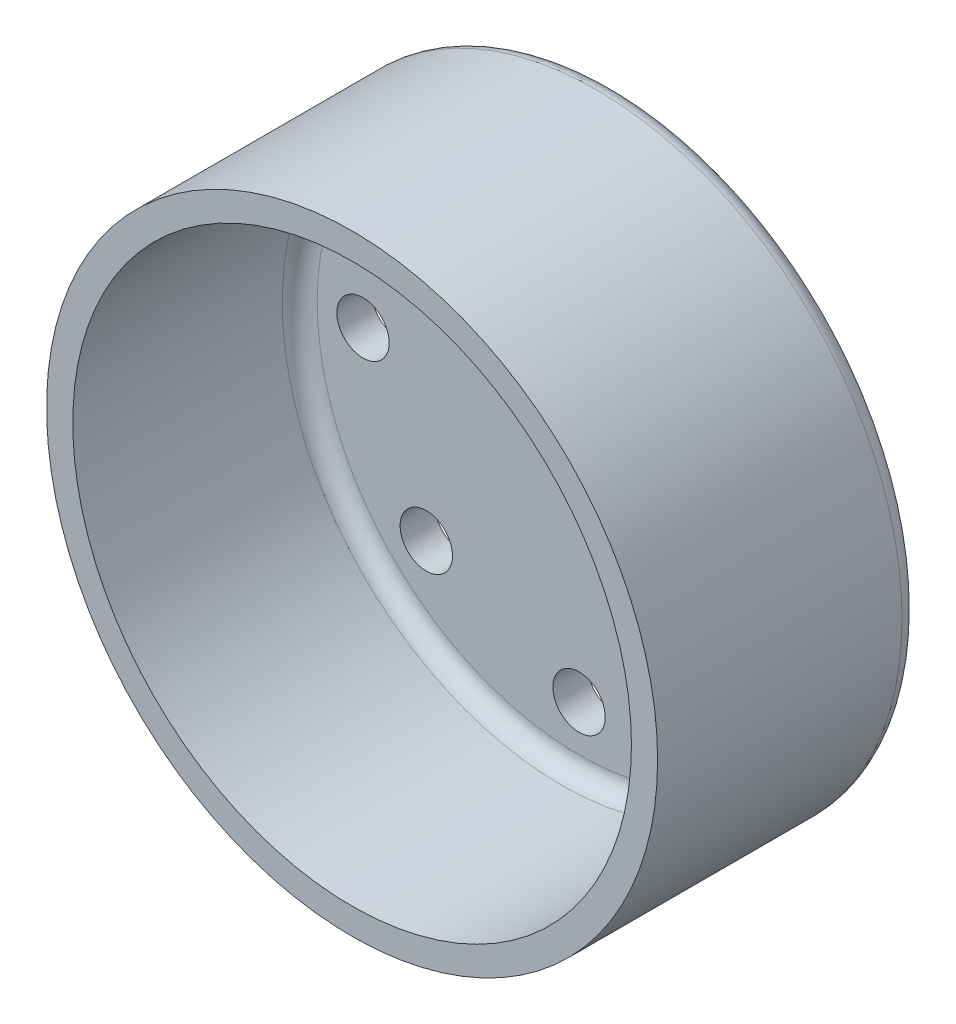
ISO-10303-21;
HEADER;
FILE_DESCRIPTION(('STEP AP214'),'2;1');
FILE_NAME('part.step','',(''),(''),'','','');
FILE_SCHEMA(('AUTOMOTIVE_DESIGN { 1 0 10303 214 1 1 1 1 }'));
ENDSEC;
DATA;
#1=APPLICATION_CONTEXT('core data for automotive mechanical design processes');
#2=APPLICATION_PROTOCOL_DEFINITION('international standard','automotive_design',2000,#1);
#3=PRODUCT_CONTEXT('',#1,'mechanical');
#4=PRODUCT('Part','Part','',(#3));
#5=PRODUCT_RELATED_PRODUCT_CATEGORY('part','',(#4));
#6=PRODUCT_DEFINITION_FORMATION('','',#4);
#7=PRODUCT_DEFINITION_CONTEXT('part definition',#1,'design');
#8=PRODUCT_DEFINITION('design','',#6,#7);
#9=PRODUCT_DEFINITION_SHAPE('','',#8);
#10=(LENGTH_UNIT() NAMED_UNIT(*) SI_UNIT(.MILLI.,.METRE.));
#11=(NAMED_UNIT(*) PLANE_ANGLE_UNIT() SI_UNIT($,.RADIAN.));
#12=(NAMED_UNIT(*) SI_UNIT($,.STERADIAN.) SOLID_ANGLE_UNIT());
#13=UNCERTAINTY_MEASURE_WITH_UNIT(LENGTH_MEASURE(1.E-05),#10,'distance_accuracy_value','');
#14=(GEOMETRIC_REPRESENTATION_CONTEXT(3) GLOBAL_UNCERTAINTY_ASSIGNED_CONTEXT((#13)) GLOBAL_UNIT_ASSIGNED_CONTEXT((#10,
#11,#12)) REPRESENTATION_CONTEXT('',''));
#15=CARTESIAN_POINT('',(0.,0.,0.));
#16=DIRECTION('',(0.,0.,1.));
#17=DIRECTION('',(1.,0.,0.));
#18=AXIS2_PLACEMENT_3D('',#15,#16,#17);
#19=CARTESIAN_POINT('',(-17.5,-17.5,60.));
#20=DIRECTION('',(0.,0.,-1.));
#21=DIRECTION('',(-1.,0.,0.));
#22=AXIS2_PLACEMENT_3D('',#19,#20,#21);
#23=CYLINDRICAL_SURFACE('',#22,3.);
#24=CARTESIAN_POINT('',(-17.5,-17.5,0.));
#25=DIRECTION('',(0.,0.,-1.));
#26=DIRECTION('',(-1.,0.,0.));
#27=AXIS2_PLACEMENT_3D('',#24,#25,#26);
#28=CIRCLE('',#27,3.);
#29=CARTESIAN_POINT('',(-20.5,-17.5,0.));
#30=VERTEX_POINT('',#29);
#31=EDGE_CURVE('E82',#30,#30,#28,.T.);
#32=ORIENTED_EDGE('',*,*,#31,.T.);
#33=EDGE_LOOP('',(#32));
#34=FACE_BOUND('',#33,.T.);
#35=CARTESIAN_POINT('',(-17.5,-17.5,4.));
#36=DIRECTION('',(0.,0.,1.));
#37=DIRECTION('',(1.,0.,0.));
#38=AXIS2_PLACEMENT_3D('',#35,#36,#37);
#39=CIRCLE('',#38,3.);
#40=CARTESIAN_POINT('',(-14.5,-17.5,4.));
#41=VERTEX_POINT('',#40);
#42=EDGE_CURVE('E95',#41,#41,#39,.F.);
#43=ORIENTED_EDGE('',*,*,#42,.F.);
#44=EDGE_LOOP('',(#43));
#45=FACE_BOUND('',#44,.T.);
#46=ADVANCED_FACE('F54',(#34,#45),#23,.F.);
#47=CARTESIAN_POINT('',(17.5,-17.5,60.));
#48=DIRECTION('',(0.,0.,-1.));
#49=DIRECTION('',(-1.,0.,0.));
#50=AXIS2_PLACEMENT_3D('',#47,#48,#49);
#51=CYLINDRICAL_SURFACE('',#50,3.);
#52=CARTESIAN_POINT('',(17.5,-17.5,0.));
#53=DIRECTION('',(0.,0.,-1.));
#54=DIRECTION('',(-1.,0.,0.));
#55=AXIS2_PLACEMENT_3D('',#52,#53,#54);
#56=CIRCLE('',#55,3.);
#57=CARTESIAN_POINT('',(14.5,-17.5,0.));
#58=VERTEX_POINT('',#57);
#59=EDGE_CURVE('E85',#58,#58,#56,.T.);
#60=ORIENTED_EDGE('',*,*,#59,.T.);
#61=EDGE_LOOP('',(#60));
#62=FACE_BOUND('',#61,.T.);
#63=CARTESIAN_POINT('',(17.5,-17.5,4.));
#64=DIRECTION('',(0.,0.,1.));
#65=DIRECTION('',(1.,0.,0.));
#66=AXIS2_PLACEMENT_3D('',#63,#64,#65);
#67=CIRCLE('',#66,3.);
#68=CARTESIAN_POINT('',(20.5,-17.5,4.));
#69=VERTEX_POINT('',#68);
#70=EDGE_CURVE('E100',#69,#69,#67,.F.);
#71=ORIENTED_EDGE('',*,*,#70,.F.);
#72=EDGE_LOOP('',(#71));
#73=FACE_BOUND('',#72,.T.);
#74=ADVANCED_FACE('F133',(#62,#73),#51,.F.);
#75=CARTESIAN_POINT('',(-24.75,0.,60.));
#76=DIRECTION('',(0.,0.,-1.));
#77=DIRECTION('',(-1.,0.,0.));
#78=AXIS2_PLACEMENT_3D('',#75,#76,#77);
#79=CYLINDRICAL_SURFACE('',#78,3.);
#80=CARTESIAN_POINT('',(-24.75,0.,0.));
#81=DIRECTION('',(0.,0.,-1.));
#82=DIRECTION('',(-1.,0.,0.));
#83=AXIS2_PLACEMENT_3D('',#80,#81,#82);
#84=CIRCLE('',#83,3.);
#85=CARTESIAN_POINT('',(-27.75,0.,0.));
#86=VERTEX_POINT('',#85);
#87=EDGE_CURVE('E86',#86,#86,#84,.T.);
#88=ORIENTED_EDGE('',*,*,#87,.T.);
#89=EDGE_LOOP('',(#88));
#90=FACE_BOUND('',#89,.T.);
#91=CARTESIAN_POINT('',(-24.75,0.,4.));
#92=DIRECTION('',(0.,0.,1.));
#93=DIRECTION('',(1.,0.,0.));
#94=AXIS2_PLACEMENT_3D('',#91,#92,#93);
#95=CIRCLE('',#94,3.);
#96=CARTESIAN_POINT('',(-21.75,0.,4.));
#97=VERTEX_POINT('',#96);
#98=EDGE_CURVE('E103',#97,#97,#95,.F.);
#99=ORIENTED_EDGE('',*,*,#98,.F.);
#100=EDGE_LOOP('',(#99));
#101=FACE_BOUND('',#100,.T.);
#102=ADVANCED_FACE('F139',(#90,#101),#79,.F.);
#103=CARTESIAN_POINT('',(24.75,0.,60.));
#104=DIRECTION('',(0.,0.,-1.));
#105=DIRECTION('',(-1.,0.,0.));
#106=AXIS2_PLACEMENT_3D('',#103,#104,#105);
#107=CYLINDRICAL_SURFACE('',#106,3.);
#108=CARTESIAN_POINT('',(24.75,0.,0.));
#109=DIRECTION('',(0.,0.,-1.));
#110=DIRECTION('',(-1.,0.,0.));
#111=AXIS2_PLACEMENT_3D('',#108,#109,#110);
#112=CIRCLE('',#111,3.);
#113=CARTESIAN_POINT('',(21.75,0.,0.));
#114=VERTEX_POINT('',#113);
#115=EDGE_CURVE('E92',#114,#114,#112,.T.);
#116=ORIENTED_EDGE('',*,*,#115,.T.);
#117=EDGE_LOOP('',(#116));
#118=FACE_BOUND('',#117,.T.);
#119=CARTESIAN_POINT('',(24.75,0.,4.));
#120=DIRECTION('',(0.,0.,1.));
#121=DIRECTION('',(1.,0.,0.));
#122=AXIS2_PLACEMENT_3D('',#119,#120,#121);
#123=CIRCLE('',#122,3.);
#124=CARTESIAN_POINT('',(27.75,0.,4.));
#125=VERTEX_POINT('',#124);
#126=EDGE_CURVE('E78',#125,#125,#123,.F.);
#127=ORIENTED_EDGE('',*,*,#126,.F.);
#128=EDGE_LOOP('',(#127));
#129=FACE_BOUND('',#128,.T.);
#130=ADVANCED_FACE('F128',(#118,#129),#107,.F.);
#131=CARTESIAN_POINT('',(0.,-24.75,60.));
#132=DIRECTION('',(0.,0.,-1.));
#133=DIRECTION('',(-1.,0.,0.));
#134=AXIS2_PLACEMENT_3D('',#131,#132,#133);
#135=CYLINDRICAL_SURFACE('',#134,3.);
#136=CARTESIAN_POINT('',(0.,-24.75,0.));
#137=DIRECTION('',(0.,0.,-1.));
#138=DIRECTION('',(-1.,0.,0.));
#139=AXIS2_PLACEMENT_3D('',#136,#137,#138);
#140=CIRCLE('',#139,3.);
#141=CARTESIAN_POINT('',(-3.,-24.75,0.));
#142=VERTEX_POINT('',#141);
#143=EDGE_CURVE('E89',#142,#142,#140,.T.);
#144=ORIENTED_EDGE('',*,*,#143,.T.);
#145=EDGE_LOOP('',(#144));
#146=FACE_BOUND('',#145,.T.);
#147=CARTESIAN_POINT('',(0.,-24.75,4.));
#148=DIRECTION('',(0.,0.,1.));
#149=DIRECTION('',(1.,0.,0.));
#150=AXIS2_PLACEMENT_3D('',#147,#148,#149);
#151=CIRCLE('',#150,3.);
#152=CARTESIAN_POINT('',(3.,-24.75,4.));
#153=VERTEX_POINT('',#152);
#154=EDGE_CURVE('E75',#153,#153,#151,.F.);
#155=ORIENTED_EDGE('',*,*,#154,.F.);
#156=EDGE_LOOP('',(#155));
#157=FACE_BOUND('',#156,.T.);
#158=ADVANCED_FACE('F122',(#146,#157),#135,.F.);
#159=CARTESIAN_POINT('',(0.,0.,30.));
#160=DIRECTION('',(0.,0.,-1.));
#161=DIRECTION('',(-1.,0.,0.));
#162=AXIS2_PLACEMENT_3D('',#159,#160,#161);
#163=CYLINDRICAL_SURFACE('',#162,35.);
#164=CARTESIAN_POINT('',(0.,0.,2.));
#165=DIRECTION('',(0.,0.,1.));
#166=DIRECTION('',(1.,0.,0.));
#167=AXIS2_PLACEMENT_3D('',#164,#165,#166);
#168=CIRCLE('',#167,35.);
#169=CARTESIAN_POINT('',(35.,0.,2.));
#170=VERTEX_POINT('',#169);
#171=EDGE_CURVE('E69',#170,#170,#168,.T.);
#172=ORIENTED_EDGE('',*,*,#171,.T.);
#173=EDGE_LOOP('',(#172));
#174=FACE_BOUND('',#173,.T.);
#175=CARTESIAN_POINT('',(0.,0.,30.));
#176=DIRECTION('',(0.,0.,1.));
#177=DIRECTION('',(1.,0.,0.));
#178=AXIS2_PLACEMENT_3D('',#175,#176,#177);
#179=CIRCLE('',#178,35.);
#180=CARTESIAN_POINT('',(35.,0.,30.));
#181=VERTEX_POINT('',#180);
#182=EDGE_CURVE('E74',#181,#181,#179,.T.);
#183=ORIENTED_EDGE('',*,*,#182,.F.);
#184=EDGE_LOOP('',(#183));
#185=FACE_BOUND('',#184,.T.);
#186=ADVANCED_FACE('F117',(#174,#185),#163,.T.);
#187=CARTESIAN_POINT('',(0.,0.,30.));
#188=DIRECTION('',(0.,0.,1.));
#189=DIRECTION('',(1.,0.,0.));
#190=AXIS2_PLACEMENT_3D('',#187,#188,#189);
#191=PLANE('',#190);
#192=CARTESIAN_POINT('',(0.,0.,30.));
#193=DIRECTION('',(0.,0.,1.));
#194=DIRECTION('',(1.,0.,0.));
#195=AXIS2_PLACEMENT_3D('',#192,#193,#194);
#196=CIRCLE('',#195,32.);
#197=CARTESIAN_POINT('',(32.,0.,30.));
#198=VERTEX_POINT('',#197);
#199=EDGE_CURVE('E79',#198,#198,#196,.T.);
#200=ORIENTED_EDGE('',*,*,#199,.F.);
#201=EDGE_LOOP('',(#200));
#202=FACE_BOUND('',#201,.T.);
#203=ORIENTED_EDGE('',*,*,#182,.T.);
#204=EDGE_LOOP('',(#203));
#205=FACE_BOUND('',#204,.T.);
#206=ADVANCED_FACE('F113',(#202,#205),#191,.T.);
#207=CARTESIAN_POINT('',(0.,0.,0.));
#208=DIRECTION('',(0.,0.,1.));
#209=DIRECTION('',(1.,0.,0.));
#210=AXIS2_PLACEMENT_3D('',#207,#208,#209);
#211=PLANE('',#210);
#212=CARTESIAN_POINT('',(0.,0.,0.));
#213=DIRECTION('',(0.,0.,1.));
#214=DIRECTION('',(1.,0.,0.));
#215=AXIS2_PLACEMENT_3D('',#212,#213,#214);
#216=CIRCLE('',#215,33.);
#217=CARTESIAN_POINT('',(33.,0.,0.));
#218=VERTEX_POINT('',#217);
#219=EDGE_CURVE('E65',#218,#218,#216,.F.);
#220=ORIENTED_EDGE('',*,*,#219,.T.);
#221=EDGE_LOOP('',(#220));
#222=FACE_BOUND('',#221,.T.);
#223=ORIENTED_EDGE('',*,*,#143,.F.);
#224=EDGE_LOOP('',(#223));
#225=FACE_BOUND('',#224,.T.);
#226=ORIENTED_EDGE('',*,*,#115,.F.);
#227=EDGE_LOOP('',(#226));
#228=FACE_BOUND('',#227,.T.);
#229=ORIENTED_EDGE('',*,*,#87,.F.);
#230=EDGE_LOOP('',(#229));
#231=FACE_BOUND('',#230,.T.);
#232=ORIENTED_EDGE('',*,*,#59,.F.);
#233=EDGE_LOOP('',(#232));
#234=FACE_BOUND('',#233,.T.);
#235=ORIENTED_EDGE('',*,*,#31,.F.);
#236=EDGE_LOOP('',(#235));
#237=FACE_BOUND('',#236,.T.);
#238=ADVANCED_FACE('F116',(#222,#225,#228,#231,#234,#237),#211,.F.);
#239=CARTESIAN_POINT('',(0.,0.,4.));
#240=DIRECTION('',(0.,0.,1.));
#241=DIRECTION('',(1.,0.,0.));
#242=AXIS2_PLACEMENT_3D('',#239,#240,#241);
#243=PLANE('',#242);
#244=CARTESIAN_POINT('',(0.,0.,4.));
#245=DIRECTION('',(0.,0.,1.));
#246=DIRECTION('',(1.,0.,0.));
#247=AXIS2_PLACEMENT_3D('',#244,#245,#246);
#248=CIRCLE('',#247,30.);
#249=CARTESIAN_POINT('',(30.,0.,4.));
#250=VERTEX_POINT('',#249);
#251=EDGE_CURVE('E61',#250,#250,#248,.T.);
#252=ORIENTED_EDGE('',*,*,#251,.T.);
#253=EDGE_LOOP('',(#252));
#254=FACE_BOUND('',#253,.T.);
#255=ORIENTED_EDGE('',*,*,#154,.T.);
#256=EDGE_LOOP('',(#255));
#257=FACE_BOUND('',#256,.T.);
#258=ORIENTED_EDGE('',*,*,#126,.T.);
#259=EDGE_LOOP('',(#258));
#260=FACE_BOUND('',#259,.T.);
#261=ORIENTED_EDGE('',*,*,#98,.T.);
#262=EDGE_LOOP('',(#261));
#263=FACE_BOUND('',#262,.T.);
#264=ORIENTED_EDGE('',*,*,#70,.T.);
#265=EDGE_LOOP('',(#264));
#266=FACE_BOUND('',#265,.T.);
#267=ORIENTED_EDGE('',*,*,#42,.T.);
#268=EDGE_LOOP('',(#267));
#269=FACE_BOUND('',#268,.T.);
#270=ADVANCED_FACE('F145',(#254,#257,#260,#263,#266,#269),#243,.T.);
#271=CARTESIAN_POINT('',(0.,0.,4.));
#272=DIRECTION('',(0.,0.,1.));
#273=DIRECTION('',(1.,0.,0.));
#274=AXIS2_PLACEMENT_3D('',#271,#272,#273);
#275=CYLINDRICAL_SURFACE('',#274,32.);
#276=CARTESIAN_POINT('',(0.,0.,6.));
#277=DIRECTION('',(0.,0.,1.));
#278=DIRECTION('',(1.,0.,0.));
#279=AXIS2_PLACEMENT_3D('',#276,#277,#278);
#280=CIRCLE('',#279,32.);
#281=CARTESIAN_POINT('',(32.,0.,6.));
#282=VERTEX_POINT('',#281);
#283=EDGE_CURVE('E11',#282,#282,#280,.F.);
#284=CARTESIAN_POINT('',(32.,0.,6.));
#285=CARTESIAN_POINT('',(32.,0.,6.25));
#286=CARTESIAN_POINT('',(32.,0.,6.5));
#287=CARTESIAN_POINT('',(32.,0.,7.));
#288=CARTESIAN_POINT('',(32.,0.,7.25));
#289=CARTESIAN_POINT('',(32.,0.,7.75));
#290=CARTESIAN_POINT('',(32.,0.,8.));
#291=CARTESIAN_POINT('',(32.,0.,8.5));
#292=CARTESIAN_POINT('',(32.,0.,8.75));
#293=CARTESIAN_POINT('',(32.,0.,9.25));
#294=CARTESIAN_POINT('',(32.,0.,9.5));
#295=CARTESIAN_POINT('',(32.,0.,10.));
#296=CARTESIAN_POINT('',(32.,0.,10.25));
#297=CARTESIAN_POINT('',(32.,0.,10.75));
#298=CARTESIAN_POINT('',(32.,0.,11.));
#299=CARTESIAN_POINT('',(32.,0.,11.5));
#300=CARTESIAN_POINT('',(32.,0.,11.75));
#301=CARTESIAN_POINT('',(32.,0.,12.25));
#302=CARTESIAN_POINT('',(32.,0.,12.5));
#303=CARTESIAN_POINT('',(32.,0.,13.));
#304=CARTESIAN_POINT('',(32.,0.,13.25));
#305=CARTESIAN_POINT('',(32.,0.,13.75));
#306=CARTESIAN_POINT('',(32.,0.,14.));
#307=CARTESIAN_POINT('',(32.,0.,14.5));
#308=CARTESIAN_POINT('',(32.,0.,14.75));
#309=CARTESIAN_POINT('',(32.,0.,15.25));
#310=CARTESIAN_POINT('',(32.,0.,15.5));
#311=CARTESIAN_POINT('',(32.,0.,16.));
#312=CARTESIAN_POINT('',(32.,0.,16.25));
#313=CARTESIAN_POINT('',(32.,0.,16.75));
#314=CARTESIAN_POINT('',(32.,0.,17.));
#315=CARTESIAN_POINT('',(32.,0.,17.5));
#316=CARTESIAN_POINT('',(32.,0.,17.75));
#317=CARTESIAN_POINT('',(32.,0.,18.25));
#318=CARTESIAN_POINT('',(32.,0.,18.5));
#319=CARTESIAN_POINT('',(32.,0.,19.));
#320=CARTESIAN_POINT('',(32.,0.,19.25));
#321=CARTESIAN_POINT('',(32.,0.,19.75));
#322=CARTESIAN_POINT('',(32.,0.,20.));
#323=CARTESIAN_POINT('',(32.,0.,20.5));
#324=CARTESIAN_POINT('',(32.,0.,20.75));
#325=CARTESIAN_POINT('',(32.,0.,21.25));
#326=CARTESIAN_POINT('',(32.,0.,21.5));
#327=CARTESIAN_POINT('',(32.,0.,22.));
#328=CARTESIAN_POINT('',(32.,0.,22.25));
#329=CARTESIAN_POINT('',(32.,0.,22.75));
#330=CARTESIAN_POINT('',(32.,0.,23.));
#331=CARTESIAN_POINT('',(32.,0.,23.5));
#332=CARTESIAN_POINT('',(32.,0.,23.75));
#333=CARTESIAN_POINT('',(32.,0.,24.25));
#334=CARTESIAN_POINT('',(32.,0.,24.5));
#335=CARTESIAN_POINT('',(32.,0.,25.));
#336=CARTESIAN_POINT('',(32.,0.,25.25));
#337=CARTESIAN_POINT('',(32.,0.,25.75));
#338=CARTESIAN_POINT('',(32.,0.,26.));
#339=CARTESIAN_POINT('',(32.,0.,26.5));
#340=CARTESIAN_POINT('',(32.,0.,26.75));
#341=CARTESIAN_POINT('',(32.,0.,27.25));
#342=CARTESIAN_POINT('',(32.,0.,27.5));
#343=CARTESIAN_POINT('',(32.,0.,28.));
#344=CARTESIAN_POINT('',(32.,0.,28.25));
#345=CARTESIAN_POINT('',(32.,0.,28.75));
#346=CARTESIAN_POINT('',(32.,0.,29.));
#347=CARTESIAN_POINT('',(32.,0.,29.5));
#348=CARTESIAN_POINT('',(32.,0.,29.75));
#349=CARTESIAN_POINT('',(32.,0.,30.));
#350=B_SPLINE_CURVE_WITH_KNOTS('',3,(#284,#285,#286,#287,#288,#289,#290,#291,#292,#293,#294,
#295,#296,#297,#298,#299,#300,#301,#302,#303,#304,#305,#306,#307,#308,#309,#310,#311,#312,#313,
#314,#315,#316,#317,#318,#319,#320,#321,#322,#323,#324,#325,#326,#327,#328,#329,#330,#331,#332,
#333,#334,#335,#336,#337,#338,#339,#340,#341,#342,#343,#344,#345,#346,#347,#348,#349),
.UNSPECIFIED.,.F.,.F.,(4,2,2,2,2,2,2,2,2,2,2,2,2,2,2,2,2,2,2,2,2,2,2,2,2,2,2,2,2,2,2,2,4),(0.,
0.749999999999999,1.5,2.25,3.,3.75,4.5,5.25,6.,6.75,7.5,8.25,9.,9.75,10.5,11.25,12.,12.75,13.5,
14.25,15.,15.75,16.5,17.25,18.,18.75,19.5,20.25,21.,21.75,22.5,23.25,24.),.UNSPECIFIED.);
#351=EDGE_CURVE('BSEAM111',#282,#198,#350,.T.);
#352=ORIENTED_EDGE('',*,*,#283,.T.);
#353=ORIENTED_EDGE('',*,*,#199,.T.);
#354=ORIENTED_EDGE('',*,*,#351,.T.);
#355=ORIENTED_EDGE('',*,*,#351,.F.);
#356=EDGE_LOOP('',(#352,#354,#353,#355));
#357=FACE_BOUND('',#356,.T.);
#358=ADVANCED_FACE('F111',(#357),#275,.F.);
#359=CARTESIAN_POINT('',(0.,0.,2.));
#360=DIRECTION('',(0.,0.,1.));
#361=DIRECTION('',(1.,0.,0.));
#362=AXIS2_PLACEMENT_3D('',#359,#360,#361);
#363=TOROIDAL_SURFACE('',#362,33.,2.);
#364=ORIENTED_EDGE('',*,*,#219,.F.);
#365=EDGE_LOOP('',(#364));
#366=FACE_BOUND('',#365,.T.);
#367=ORIENTED_EDGE('',*,*,#171,.F.);
#368=EDGE_LOOP('',(#367));
#369=FACE_BOUND('',#368,.T.);
#370=ADVANCED_FACE('F182',(#366,#369),#363,.T.);
#371=CARTESIAN_POINT('',(0.,0.,6.));
#372=DIRECTION('',(0.,0.,1.));
#373=DIRECTION('',(1.,0.,0.));
#374=AXIS2_PLACEMENT_3D('',#371,#372,#373);
#375=TOROIDAL_SURFACE('',#374,30.,2.);
#376=ORIENTED_EDGE('',*,*,#283,.F.);
#377=EDGE_LOOP('',(#376));
#378=FACE_BOUND('',#377,.T.);
#379=ORIENTED_EDGE('',*,*,#251,.F.);
#380=EDGE_LOOP('',(#379));
#381=FACE_BOUND('',#380,.T.);
#382=ADVANCED_FACE('F56',(#378,#381),#375,.F.);
#383=CLOSED_SHELL('',(#46,#74,#102,#130,#158,#186,#206,#238,#270,#358,#370,#382));
#384=MANIFOLD_SOLID_BREP('B2',#383);
#385=ADVANCED_BREP_SHAPE_REPRESENTATION('',(#18,#384),#14);
#386=SHAPE_DEFINITION_REPRESENTATION(#9,#385);
ENDSEC;
END-ISO-10303-21;
